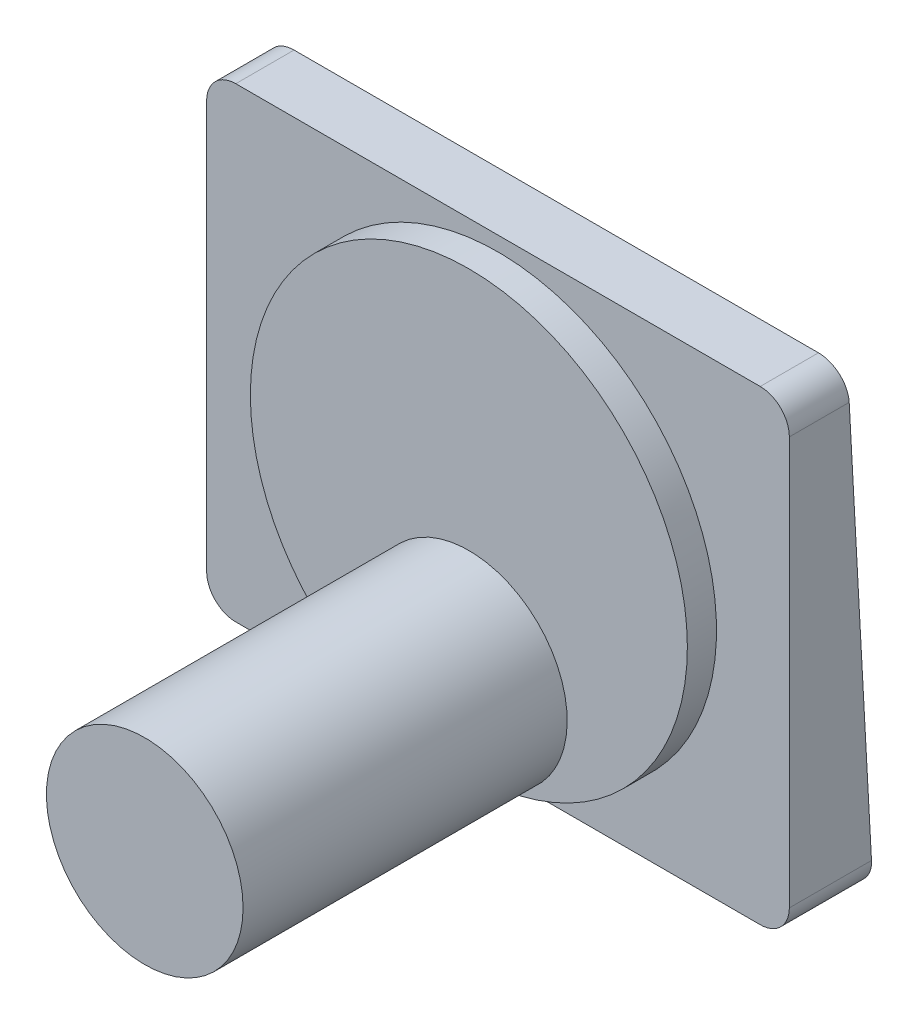
ISO-10303-21;
HEADER;
FILE_DESCRIPTION(('STEP AP214'),'2;1');
FILE_NAME('part.step','',(''),(''),'','','');
FILE_SCHEMA(('AUTOMOTIVE_DESIGN { 1 0 10303 214 1 1 1 1 }'));
ENDSEC;
DATA;
#1=APPLICATION_CONTEXT('core data for automotive mechanical design processes');
#2=APPLICATION_PROTOCOL_DEFINITION('international standard','automotive_design',2000,#1);
#3=PRODUCT_CONTEXT('',#1,'mechanical');
#4=PRODUCT('Part','Part','',(#3));
#5=PRODUCT_RELATED_PRODUCT_CATEGORY('part','',(#4));
#6=PRODUCT_DEFINITION_FORMATION('','',#4);
#7=PRODUCT_DEFINITION_CONTEXT('part definition',#1,'design');
#8=PRODUCT_DEFINITION('design','',#6,#7);
#9=PRODUCT_DEFINITION_SHAPE('','',#8);
#10=(LENGTH_UNIT() NAMED_UNIT(*) SI_UNIT(.MILLI.,.METRE.));
#11=(NAMED_UNIT(*) PLANE_ANGLE_UNIT() SI_UNIT($,.RADIAN.));
#12=(NAMED_UNIT(*) SI_UNIT($,.STERADIAN.) SOLID_ANGLE_UNIT());
#13=UNCERTAINTY_MEASURE_WITH_UNIT(LENGTH_MEASURE(1.E-05),#10,'distance_accuracy_value','');
#14=(GEOMETRIC_REPRESENTATION_CONTEXT(3) GLOBAL_UNCERTAINTY_ASSIGNED_CONTEXT((#13)) GLOBAL_UNIT_ASSIGNED_CONTEXT((#10,
#11,#12)) REPRESENTATION_CONTEXT('',''));
#15=CARTESIAN_POINT('',(0.,0.,0.));
#16=DIRECTION('',(0.,0.,1.));
#17=DIRECTION('',(1.,0.,0.));
#18=AXIS2_PLACEMENT_3D('',#15,#16,#17);
#19=CARTESIAN_POINT('',(40.,32.,0.));
#20=DIRECTION('',(0.,0.,-1.));
#21=DIRECTION('',(-1.,0.,0.));
#22=AXIS2_PLACEMENT_3D('',#19,#20,#21);
#23=PLANE('',#22);
#24=DIRECTION('',(0.,-1.,0.));
#25=VECTOR('',#24,1.);
#26=CARTESIAN_POINT('',(-40.,32.,0.));
#27=LINE('',#26,#25);
#28=CARTESIAN_POINT('',(-40.,28.,0.));
#29=VERTEX_POINT('',#28);
#30=CARTESIAN_POINT('',(-40.,-28.,0.));
#31=VERTEX_POINT('',#30);
#32=EDGE_CURVE('E112',#29,#31,#27,.T.);
#33=ORIENTED_EDGE('',*,*,#32,.T.);
#34=CARTESIAN_POINT('',(-36.,-28.,0.));
#35=DIRECTION('',(0.,0.,-1.));
#36=DIRECTION('',(-1.,0.,0.));
#37=AXIS2_PLACEMENT_3D('',#34,#35,#36);
#38=CIRCLE('',#37,4.);
#39=CARTESIAN_POINT('',(-36.,-32.,0.));
#40=VERTEX_POINT('',#39);
#41=EDGE_CURVE('E167',#31,#40,#38,.F.);
#42=ORIENTED_EDGE('',*,*,#41,.T.);
#43=DIRECTION('',(-1.,0.,0.));
#44=VECTOR('',#43,1.);
#45=CARTESIAN_POINT('',(40.,-32.,0.));
#46=LINE('',#45,#44);
#47=CARTESIAN_POINT('',(36.,-32.,0.));
#48=VERTEX_POINT('',#47);
#49=EDGE_CURVE('E139',#48,#40,#46,.T.);
#50=ORIENTED_EDGE('',*,*,#49,.F.);
#51=CARTESIAN_POINT('',(36.,-28.,0.));
#52=DIRECTION('',(0.,0.,-1.));
#53=DIRECTION('',(-1.,0.,0.));
#54=AXIS2_PLACEMENT_3D('',#51,#52,#53);
#55=CIRCLE('',#54,4.);
#56=CARTESIAN_POINT('',(40.,-28.,0.));
#57=VERTEX_POINT('',#56);
#58=EDGE_CURVE('E165',#48,#57,#55,.F.);
#59=ORIENTED_EDGE('',*,*,#58,.T.);
#60=DIRECTION('',(0.,-1.,0.));
#61=VECTOR('',#60,1.);
#62=CARTESIAN_POINT('',(40.,32.,0.));
#63=LINE('',#62,#61);
#64=CARTESIAN_POINT('',(40.,28.,0.));
#65=VERTEX_POINT('',#64);
#66=EDGE_CURVE('E122',#65,#57,#63,.T.);
#67=ORIENTED_EDGE('',*,*,#66,.F.);
#68=CARTESIAN_POINT('',(36.,28.,0.));
#69=DIRECTION('',(0.,0.,-1.));
#70=DIRECTION('',(-1.,0.,0.));
#71=AXIS2_PLACEMENT_3D('',#68,#69,#70);
#72=CIRCLE('',#71,4.);
#73=CARTESIAN_POINT('',(36.,32.,0.));
#74=VERTEX_POINT('',#73);
#75=EDGE_CURVE('E162',#65,#74,#72,.F.);
#76=ORIENTED_EDGE('',*,*,#75,.T.);
#77=DIRECTION('',(-1.,0.,0.));
#78=VECTOR('',#77,1.);
#79=CARTESIAN_POINT('',(40.,32.,0.));
#80=LINE('',#79,#78);
#81=CARTESIAN_POINT('',(-36.,32.,0.));
#82=VERTEX_POINT('',#81);
#83=EDGE_CURVE('E142',#74,#82,#80,.T.);
#84=ORIENTED_EDGE('',*,*,#83,.T.);
#85=CARTESIAN_POINT('',(-36.,28.,0.));
#86=DIRECTION('',(0.,0.,-1.));
#87=DIRECTION('',(-1.,0.,0.));
#88=AXIS2_PLACEMENT_3D('',#85,#86,#87);
#89=CIRCLE('',#88,4.);
#90=EDGE_CURVE('E55',#82,#29,#89,.F.);
#91=ORIENTED_EDGE('',*,*,#90,.T.);
#92=EDGE_LOOP('',(#33,#42,#50,#59,#67,#76,#84,#91));
#93=FACE_BOUND('',#92,.T.);
#94=CARTESIAN_POINT('',(0.,0.,0.));
#95=DIRECTION('',(0.,0.,-1.));
#96=DIRECTION('',(-1.,0.,0.));
#97=AXIS2_PLACEMENT_3D('',#94,#95,#96);
#98=CIRCLE('',#97,30.);
#99=CARTESIAN_POINT('',(-30.,0.,0.));
#100=VERTEX_POINT('',#99);
#101=EDGE_CURVE('E37',#100,#100,#98,.F.);
#102=ORIENTED_EDGE('',*,*,#101,.F.);
#103=EDGE_LOOP('',(#102));
#104=FACE_BOUND('',#103,.T.);
#105=ADVANCED_FACE('F33',(#93,#104),#23,.F.);
#106=CARTESIAN_POINT('',(40.,32.,-8.00000000000001));
#107=DIRECTION('',(0.,-1.,0.));
#108=DIRECTION('',(0.,0.,-1.));
#109=AXIS2_PLACEMENT_3D('',#106,#107,#108);
#110=PLANE('',#109);
#111=DIRECTION('',(-1.,0.,0.));
#112=VECTOR('',#111,1.);
#113=CARTESIAN_POINT('',(40.,32.,-8.00000000000001));
#114=LINE('',#113,#112);
#115=CARTESIAN_POINT('',(36.,32.,-8.00000000000001));
#116=VERTEX_POINT('',#115);
#117=CARTESIAN_POINT('',(-36.,32.,-8.00000000000001));
#118=VERTEX_POINT('',#117);
#119=EDGE_CURVE('E129',#116,#118,#114,.T.);
#120=ORIENTED_EDGE('',*,*,#119,.T.);
#121=DIRECTION('',(0.,0.,1.));
#122=VECTOR('',#121,1.);
#123=CARTESIAN_POINT('',(-36.,32.,-8.00000000000001));
#124=LINE('',#123,#122);
#125=EDGE_CURVE('E176',#118,#82,#124,.T.);
#126=ORIENTED_EDGE('',*,*,#125,.T.);
#127=ORIENTED_EDGE('',*,*,#83,.F.);
#128=DIRECTION('',(0.,0.,1.));
#129=VECTOR('',#128,1.);
#130=CARTESIAN_POINT('',(36.,32.,-8.00000000000001));
#131=LINE('',#130,#129);
#132=EDGE_CURVE('E175',#74,#116,#131,.F.);
#133=ORIENTED_EDGE('',*,*,#132,.T.);
#134=EDGE_LOOP('',(#120,#126,#127,#133));
#135=FACE_BOUND('',#134,.T.);
#136=ADVANCED_FACE('F183',(#135),#110,.F.);
#137=CARTESIAN_POINT('',(40.,-32.,0.));
#138=DIRECTION('',(0.,1.,0.));
#139=DIRECTION('',(0.,0.,1.));
#140=AXIS2_PLACEMENT_3D('',#137,#138,#139);
#141=PLANE('',#140);
#142=ORIENTED_EDGE('',*,*,#49,.T.);
#143=DIRECTION('',(0.,0.,-1.));
#144=VECTOR('',#143,1.);
#145=CARTESIAN_POINT('',(-36.,-32.,0.));
#146=LINE('',#145,#144);
#147=CARTESIAN_POINT('',(-36.,-32.,-11.5));
#148=VERTEX_POINT('',#147);
#149=EDGE_CURVE('E147',#40,#148,#146,.T.);
#150=ORIENTED_EDGE('',*,*,#149,.T.);
#151=DIRECTION('',(-1.,0.,0.));
#152=VECTOR('',#151,1.);
#153=CARTESIAN_POINT('',(40.,-32.,-11.5));
#154=LINE('',#153,#152);
#155=CARTESIAN_POINT('',(36.,-32.,-11.5));
#156=VERTEX_POINT('',#155);
#157=EDGE_CURVE('E136',#156,#148,#154,.T.);
#158=ORIENTED_EDGE('',*,*,#157,.F.);
#159=DIRECTION('',(0.,0.,-1.));
#160=VECTOR('',#159,1.);
#161=CARTESIAN_POINT('',(36.,-32.,0.));
#162=LINE('',#161,#160);
#163=EDGE_CURVE('E145',#156,#48,#162,.F.);
#164=ORIENTED_EDGE('',*,*,#163,.T.);
#165=EDGE_LOOP('',(#142,#150,#158,#164));
#166=FACE_BOUND('',#165,.T.);
#167=ADVANCED_FACE('F189',(#166),#141,.F.);
#168=CARTESIAN_POINT('',(40.,-32.,-11.5));
#169=DIRECTION('',(0.,-0.0546059054019325,0.99850798449248));
#170=DIRECTION('',(0.,-0.99850798449248,-0.0546059054019325));
#171=AXIS2_PLACEMENT_3D('',#168,#169,#170);
#172=PLANE('',#171);
#173=ORIENTED_EDGE('',*,*,#157,.T.);
#174=CARTESIAN_POINT('',(-36.,-28.,-11.28125));
#175=DIRECTION('',(0.,-0.0546059054019325,0.99850798449248));
#176=DIRECTION('',(0.,-0.99850798449248,-0.0546059054019325));
#177=AXIS2_PLACEMENT_3D('',#174,#175,#176);
#178=ELLIPSE('',#177,4.00597697977659,4.);
#179=CARTESIAN_POINT('',(-40.,-28.,-11.28125));
#180=VERTEX_POINT('',#179);
#181=EDGE_CURVE('E156',#148,#180,#178,.F.);
#182=ORIENTED_EDGE('',*,*,#181,.T.);
#183=DIRECTION('',(0.,0.99850798449248,0.0546059054019325));
#184=VECTOR('',#183,1.);
#185=CARTESIAN_POINT('',(-40.,-32.,-11.5));
#186=LINE('',#185,#184);
#187=CARTESIAN_POINT('',(-40.,28.,-8.21875000000001));
#188=VERTEX_POINT('',#187);
#189=EDGE_CURVE('E126',#180,#188,#186,.T.);
#190=ORIENTED_EDGE('',*,*,#189,.T.);
#191=CARTESIAN_POINT('',(-36.,28.,-8.21875000000001));
#192=DIRECTION('',(0.,-0.0546059054019325,0.99850798449248));
#193=DIRECTION('',(0.,0.99850798449248,0.0546059054019325));
#194=AXIS2_PLACEMENT_3D('',#191,#192,#193);
#195=ELLIPSE('',#194,4.00597697977659,4.);
#196=EDGE_CURVE('E152',#188,#118,#195,.F.);
#197=ORIENTED_EDGE('',*,*,#196,.T.);
#198=ORIENTED_EDGE('',*,*,#119,.F.);
#199=CARTESIAN_POINT('',(36.,28.,-8.21875000000001));
#200=DIRECTION('',(0.,-0.0546059054019325,0.99850798449248));
#201=DIRECTION('',(0.,-0.99850798449248,-0.0546059054019325));
#202=AXIS2_PLACEMENT_3D('',#199,#200,#201);
#203=ELLIPSE('',#202,4.00597697977659,4.);
#204=CARTESIAN_POINT('',(40.,28.,-8.21875000000001));
#205=VERTEX_POINT('',#204);
#206=EDGE_CURVE('E150',#116,#205,#203,.F.);
#207=ORIENTED_EDGE('',*,*,#206,.T.);
#208=DIRECTION('',(0.,0.99850798449248,0.0546059054019325));
#209=VECTOR('',#208,1.);
#210=CARTESIAN_POINT('',(40.,-32.,-11.5));
#211=LINE('',#210,#209);
#212=CARTESIAN_POINT('',(40.,-28.,-11.28125));
#213=VERTEX_POINT('',#212);
#214=EDGE_CURVE('E125',#213,#205,#211,.T.);
#215=ORIENTED_EDGE('',*,*,#214,.F.);
#216=CARTESIAN_POINT('',(36.,-28.,-11.28125));
#217=DIRECTION('',(0.,-0.0546059054019325,0.99850798449248));
#218=DIRECTION('',(0.,0.99850798449248,0.0546059054019325));
#219=AXIS2_PLACEMENT_3D('',#216,#217,#218);
#220=ELLIPSE('',#219,4.00597697977659,4.);
#221=EDGE_CURVE('E154',#213,#156,#220,.F.);
#222=ORIENTED_EDGE('',*,*,#221,.T.);
#223=EDGE_LOOP('',(#173,#182,#190,#197,#198,#207,#215,#222));
#224=FACE_BOUND('',#223,.T.);
#225=ADVANCED_FACE('F211',(#224),#172,.F.);
#226=CARTESIAN_POINT('',(40.,0.,0.));
#227=DIRECTION('',(1.,0.,0.));
#228=DIRECTION('',(0.,0.,-1.));
#229=AXIS2_PLACEMENT_3D('',#226,#227,#228);
#230=PLANE('',#229);
#231=ORIENTED_EDGE('',*,*,#66,.T.);
#232=DIRECTION('',(0.,0.,-1.));
#233=VECTOR('',#232,1.);
#234=CARTESIAN_POINT('',(40.,-28.,-11.5));
#235=LINE('',#234,#233);
#236=EDGE_CURVE('E172',#57,#213,#235,.T.);
#237=ORIENTED_EDGE('',*,*,#236,.T.);
#238=ORIENTED_EDGE('',*,*,#214,.T.);
#239=DIRECTION('',(0.,0.,1.));
#240=VECTOR('',#239,1.);
#241=CARTESIAN_POINT('',(40.,28.,0.));
#242=LINE('',#241,#240);
#243=EDGE_CURVE('E169',#205,#65,#242,.T.);
#244=ORIENTED_EDGE('',*,*,#243,.T.);
#245=EDGE_LOOP('',(#231,#237,#238,#244));
#246=FACE_BOUND('',#245,.T.);
#247=ADVANCED_FACE('F218',(#246),#230,.T.);
#248=CARTESIAN_POINT('',(-40.,0.,0.));
#249=DIRECTION('',(1.,0.,0.));
#250=DIRECTION('',(0.,0.,-1.));
#251=AXIS2_PLACEMENT_3D('',#248,#249,#250);
#252=PLANE('',#251);
#253=ORIENTED_EDGE('',*,*,#189,.F.);
#254=DIRECTION('',(0.,0.,-1.));
#255=VECTOR('',#254,1.);
#256=CARTESIAN_POINT('',(-40.,-28.,0.));
#257=LINE('',#256,#255);
#258=EDGE_CURVE('E160',#180,#31,#257,.F.);
#259=ORIENTED_EDGE('',*,*,#258,.T.);
#260=ORIENTED_EDGE('',*,*,#32,.F.);
#261=DIRECTION('',(0.,0.,1.));
#262=VECTOR('',#261,1.);
#263=CARTESIAN_POINT('',(-40.,28.,0.));
#264=LINE('',#263,#262);
#265=EDGE_CURVE('E158',#29,#188,#264,.F.);
#266=ORIENTED_EDGE('',*,*,#265,.T.);
#267=EDGE_LOOP('',(#253,#259,#260,#266));
#268=FACE_BOUND('',#267,.T.);
#269=ADVANCED_FACE('F198',(#268),#252,.F.);
#270=CARTESIAN_POINT('',(-36.,-28.,0.));
#271=DIRECTION('',(0.,0.,-1.));
#272=DIRECTION('',(-1.,0.,0.));
#273=AXIS2_PLACEMENT_3D('',#270,#271,#272);
#274=CYLINDRICAL_SURFACE('',#273,4.);
#275=ORIENTED_EDGE('',*,*,#41,.F.);
#276=ORIENTED_EDGE('',*,*,#258,.F.);
#277=ORIENTED_EDGE('',*,*,#181,.F.);
#278=ORIENTED_EDGE('',*,*,#149,.F.);
#279=EDGE_LOOP('',(#275,#276,#277,#278));
#280=FACE_BOUND('',#279,.T.);
#281=ADVANCED_FACE('F194',(#280),#274,.T.);
#282=CARTESIAN_POINT('',(36.,-28.,0.));
#283=DIRECTION('',(0.,0.,1.));
#284=DIRECTION('',(1.,0.,0.));
#285=AXIS2_PLACEMENT_3D('',#282,#283,#284);
#286=CYLINDRICAL_SURFACE('',#285,4.);
#287=ORIENTED_EDGE('',*,*,#58,.F.);
#288=ORIENTED_EDGE('',*,*,#163,.F.);
#289=ORIENTED_EDGE('',*,*,#221,.F.);
#290=ORIENTED_EDGE('',*,*,#236,.F.);
#291=EDGE_LOOP('',(#287,#288,#289,#290));
#292=FACE_BOUND('',#291,.T.);
#293=ADVANCED_FACE('F197',(#292),#286,.T.);
#294=CARTESIAN_POINT('',(-36.,28.,-8.00000000000001));
#295=DIRECTION('',(0.,0.,1.));
#296=DIRECTION('',(1.,0.,0.));
#297=AXIS2_PLACEMENT_3D('',#294,#295,#296);
#298=CYLINDRICAL_SURFACE('',#297,4.);
#299=ORIENTED_EDGE('',*,*,#196,.F.);
#300=ORIENTED_EDGE('',*,*,#265,.F.);
#301=ORIENTED_EDGE('',*,*,#90,.F.);
#302=ORIENTED_EDGE('',*,*,#125,.F.);
#303=EDGE_LOOP('',(#299,#300,#301,#302));
#304=FACE_BOUND('',#303,.T.);
#305=ADVANCED_FACE('F201',(#304),#298,.T.);
#306=CARTESIAN_POINT('',(36.,28.,0.));
#307=DIRECTION('',(0.,0.,-1.));
#308=DIRECTION('',(-1.,0.,0.));
#309=AXIS2_PLACEMENT_3D('',#306,#307,#308);
#310=CYLINDRICAL_SURFACE('',#309,4.);
#311=ORIENTED_EDGE('',*,*,#206,.F.);
#312=ORIENTED_EDGE('',*,*,#132,.F.);
#313=ORIENTED_EDGE('',*,*,#75,.F.);
#314=ORIENTED_EDGE('',*,*,#243,.F.);
#315=EDGE_LOOP('',(#311,#312,#313,#314));
#316=FACE_BOUND('',#315,.T.);
#317=ADVANCED_FACE('F35',(#316),#310,.T.);
#318=CARTESIAN_POINT('',(0.,0.,4.));
#319=DIRECTION('',(0.,0.,-1.));
#320=DIRECTION('',(-1.,0.,0.));
#321=AXIS2_PLACEMENT_3D('',#318,#319,#320);
#322=CYLINDRICAL_SURFACE('',#321,30.);
#323=CARTESIAN_POINT('',(0.,0.,4.));
#324=DIRECTION('',(0.,0.,1.));
#325=DIRECTION('',(1.,0.,0.));
#326=AXIS2_PLACEMENT_3D('',#323,#324,#325);
#327=CIRCLE('',#326,30.);
#328=CARTESIAN_POINT('',(-4.81980106087752,-29.6102941176471,4.));
#329=VERTEX_POINT('',#328);
#330=CARTESIAN_POINT('',(4.81980106087752,-29.6102941176471,4.));
#331=VERTEX_POINT('',#330);
#332=EDGE_CURVE('E105',#329,#331,#327,.T.);
#333=ORIENTED_EDGE('',*,*,#332,.F.);
#334=EDGE_CURVE('E108',#331,#329,#327,.T.);
#335=ORIENTED_EDGE('',*,*,#334,.F.);
#336=EDGE_LOOP('',(#333,#335));
#337=FACE_BOUND('',#336,.T.);
#338=ORIENTED_EDGE('',*,*,#101,.T.);
#339=EDGE_LOOP('',(#338));
#340=FACE_BOUND('',#339,.T.);
#341=ADVANCED_FACE('F106',(#337,#340),#322,.T.);
#342=CARTESIAN_POINT('',(0.,0.,4.));
#343=DIRECTION('',(0.,0.,1.));
#344=DIRECTION('',(1.,0.,0.));
#345=AXIS2_PLACEMENT_3D('',#342,#343,#344);
#346=PLANE('',#345);
#347=CARTESIAN_POINT('',(0.,-17.,4.));
#348=DIRECTION('',(0.,0.,1.));
#349=DIRECTION('',(1.,0.,0.));
#350=AXIS2_PLACEMENT_3D('',#347,#348,#349);
#351=CIRCLE('',#350,13.5);
#352=EDGE_CURVE('E11',#331,#329,#351,.T.);
#353=ORIENTED_EDGE('',*,*,#352,.F.);
#354=ORIENTED_EDGE('',*,*,#334,.T.);
#355=EDGE_LOOP('',(#353,#354));
#356=FACE_BOUND('',#355,.T.);
#357=ADVANCED_FACE('F114',(#356),#346,.T.);
#358=CARTESIAN_POINT('',(0.,-17.,4.));
#359=DIRECTION('',(0.,0.,1.));
#360=DIRECTION('',(1.,0.,0.));
#361=AXIS2_PLACEMENT_3D('',#358,#359,#360);
#362=PLANE('',#361);
#363=EDGE_CURVE('E43',#329,#331,#351,.T.);
#364=ORIENTED_EDGE('',*,*,#363,.F.);
#365=ORIENTED_EDGE('',*,*,#332,.T.);
#366=EDGE_LOOP('',(#364,#365));
#367=FACE_BOUND('',#366,.T.);
#368=ADVANCED_FACE('F118',(#367),#362,.F.);
#369=CARTESIAN_POINT('',(0.,-17.,48.5));
#370=DIRECTION('',(0.,0.,-1.));
#371=DIRECTION('',(-1.,0.,0.));
#372=AXIS2_PLACEMENT_3D('',#369,#370,#371);
#373=CYLINDRICAL_SURFACE('',#372,13.5);
#374=CARTESIAN_POINT('',(0.,-17.,48.5));
#375=DIRECTION('',(0.,0.,1.));
#376=DIRECTION('',(1.,0.,0.));
#377=AXIS2_PLACEMENT_3D('',#374,#375,#376);
#378=CIRCLE('',#377,13.5);
#379=CARTESIAN_POINT('',(13.5,-17.,48.5));
#380=VERTEX_POINT('',#379);
#381=EDGE_CURVE('E115',#380,#380,#378,.T.);
#382=ORIENTED_EDGE('',*,*,#381,.F.);
#383=EDGE_LOOP('',(#382));
#384=FACE_BOUND('',#383,.T.);
#385=ORIENTED_EDGE('',*,*,#363,.T.);
#386=ORIENTED_EDGE('',*,*,#352,.T.);
#387=EDGE_LOOP('',(#385,#386));
#388=FACE_BOUND('',#387,.T.);
#389=ADVANCED_FACE('F117',(#384,#388),#373,.T.);
#390=CARTESIAN_POINT('',(0.,-17.,48.5));
#391=DIRECTION('',(0.,0.,1.));
#392=DIRECTION('',(1.,0.,0.));
#393=AXIS2_PLACEMENT_3D('',#390,#391,#392);
#394=PLANE('',#393);
#395=ORIENTED_EDGE('',*,*,#381,.T.);
#396=EDGE_LOOP('',(#395));
#397=FACE_BOUND('',#396,.T.);
#398=ADVANCED_FACE('F316',(#397),#394,.T.);
#399=CLOSED_SHELL('',(#105,#136,#167,#225,#247,#269,#281,#293,#305,#317,#341,#357,#368,#389,#398));
#400=MANIFOLD_SOLID_BREP('B2',#399);
#401=ADVANCED_BREP_SHAPE_REPRESENTATION('',(#18,#400),#14);
#402=SHAPE_DEFINITION_REPRESENTATION(#9,#401);
ENDSEC;
END-ISO-10303-21;
